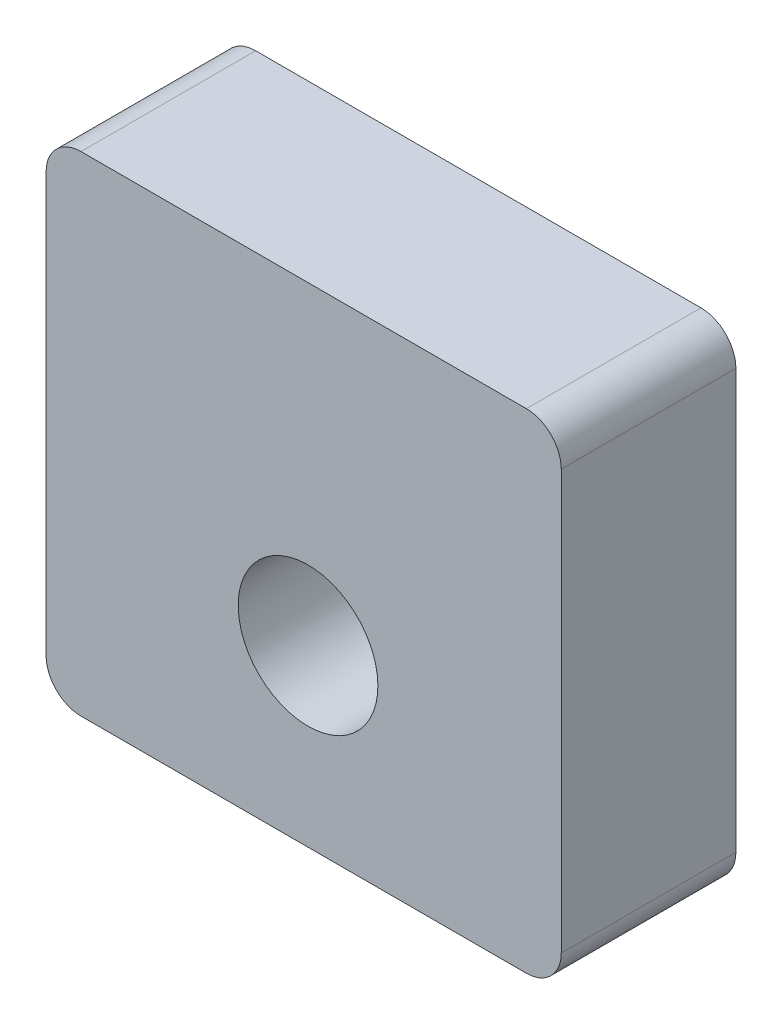
ISO-10303-21;
HEADER;
FILE_DESCRIPTION(('STEP AP214'),'2;1');
FILE_NAME('part.step','',(''),(''),'','','');
FILE_SCHEMA(('AUTOMOTIVE_DESIGN { 1 0 10303 214 1 1 1 1 }'));
ENDSEC;
DATA;
#1=APPLICATION_CONTEXT('core data for automotive mechanical design processes');
#2=APPLICATION_PROTOCOL_DEFINITION('international standard','automotive_design',2000,#1);
#3=PRODUCT_CONTEXT('',#1,'mechanical');
#4=PRODUCT('Part','Part','',(#3));
#5=PRODUCT_RELATED_PRODUCT_CATEGORY('part','',(#4));
#6=PRODUCT_DEFINITION_FORMATION('','',#4);
#7=PRODUCT_DEFINITION_CONTEXT('part definition',#1,'design');
#8=PRODUCT_DEFINITION('design','',#6,#7);
#9=PRODUCT_DEFINITION_SHAPE('','',#8);
#10=(LENGTH_UNIT() NAMED_UNIT(*) SI_UNIT(.MILLI.,.METRE.));
#11=(NAMED_UNIT(*) PLANE_ANGLE_UNIT() SI_UNIT($,.RADIAN.));
#12=(NAMED_UNIT(*) SI_UNIT($,.STERADIAN.) SOLID_ANGLE_UNIT());
#13=UNCERTAINTY_MEASURE_WITH_UNIT(LENGTH_MEASURE(1.E-05),#10,'distance_accuracy_value','');
#14=(GEOMETRIC_REPRESENTATION_CONTEXT(3) GLOBAL_UNCERTAINTY_ASSIGNED_CONTEXT((#13)) GLOBAL_UNIT_ASSIGNED_CONTEXT((#10,
#11,#12)) REPRESENTATION_CONTEXT('',''));
#15=CARTESIAN_POINT('',(0.,0.,0.));
#16=DIRECTION('',(0.,0.,1.));
#17=DIRECTION('',(1.,0.,0.));
#18=AXIS2_PLACEMENT_3D('',#15,#16,#17);
#19=CARTESIAN_POINT('',(-0.25,4.,10.));
#20=DIRECTION('',(0.,0.,1.));
#21=DIRECTION('',(1.,0.,0.));
#22=AXIS2_PLACEMENT_3D('',#19,#20,#21);
#23=PLANE('',#22);
#24=CARTESIAN_POINT('',(0.,0.,10.));
#25=DIRECTION('',(0.,0.,1.));
#26=DIRECTION('',(1.,0.,0.));
#27=AXIS2_PLACEMENT_3D('',#24,#25,#26);
#28=CIRCLE('',#27,4.);
#29=CARTESIAN_POINT('',(4.,0.,10.));
#30=VERTEX_POINT('',#29);
#31=EDGE_CURVE('E129',#30,#30,#28,.F.);
#32=ORIENTED_EDGE('',*,*,#31,.T.);
#33=EDGE_LOOP('',(#32));
#34=FACE_BOUND('',#33,.T.);
#35=DIRECTION('',(1.,0.,0.));
#36=VECTOR('',#35,1.);
#37=CARTESIAN_POINT('',(12.5,-10.,10.));
#38=LINE('',#37,#36);
#39=CARTESIAN_POINT('',(12.5,-10.,10.));
#40=VERTEX_POINT('',#39);
#41=CARTESIAN_POINT('',(-13.,-10.,10.));
#42=VERTEX_POINT('',#41);
#43=EDGE_CURVE('E113',#40,#42,#38,.F.);
#44=ORIENTED_EDGE('',*,*,#43,.F.);
#45=CARTESIAN_POINT('',(12.5,-8.,10.));
#46=DIRECTION('',(0.,0.,1.));
#47=DIRECTION('',(1.,0.,0.));
#48=AXIS2_PLACEMENT_3D('',#45,#46,#47);
#49=CIRCLE('',#48,2.);
#50=CARTESIAN_POINT('',(14.5,-8.,10.));
#51=VERTEX_POINT('',#50);
#52=EDGE_CURVE('E134',#51,#40,#49,.F.);
#53=ORIENTED_EDGE('',*,*,#52,.F.);
#54=DIRECTION('',(0.,1.,0.));
#55=VECTOR('',#54,1.);
#56=CARTESIAN_POINT('',(14.5,16.,10.));
#57=LINE('',#56,#55);
#58=CARTESIAN_POINT('',(14.5,16.,10.));
#59=VERTEX_POINT('',#58);
#60=EDGE_CURVE('E109',#59,#51,#57,.F.);
#61=ORIENTED_EDGE('',*,*,#60,.F.);
#62=CARTESIAN_POINT('',(12.5,16.,10.));
#63=DIRECTION('',(0.,0.,1.));
#64=DIRECTION('',(1.,0.,0.));
#65=AXIS2_PLACEMENT_3D('',#62,#63,#64);
#66=CIRCLE('',#65,2.);
#67=CARTESIAN_POINT('',(12.5,18.,10.));
#68=VERTEX_POINT('',#67);
#69=EDGE_CURVE('E96',#68,#59,#66,.F.);
#70=ORIENTED_EDGE('',*,*,#69,.F.);
#71=DIRECTION('',(1.,0.,0.));
#72=VECTOR('',#71,1.);
#73=CARTESIAN_POINT('',(-13.,18.,10.));
#74=LINE('',#73,#72);
#75=CARTESIAN_POINT('',(-13.,18.,10.));
#76=VERTEX_POINT('',#75);
#77=EDGE_CURVE('E92',#76,#68,#74,.T.);
#78=ORIENTED_EDGE('',*,*,#77,.F.);
#79=CARTESIAN_POINT('',(-13.,16.,10.));
#80=DIRECTION('',(0.,0.,1.));
#81=DIRECTION('',(1.,0.,0.));
#82=AXIS2_PLACEMENT_3D('',#79,#80,#81);
#83=CIRCLE('',#82,2.);
#84=CARTESIAN_POINT('',(-15.,16.,10.));
#85=VERTEX_POINT('',#84);
#86=EDGE_CURVE('E20',#85,#76,#83,.F.);
#87=ORIENTED_EDGE('',*,*,#86,.F.);
#88=DIRECTION('',(0.,1.,0.));
#89=VECTOR('',#88,1.);
#90=CARTESIAN_POINT('',(-15.,-8.,10.));
#91=LINE('',#90,#89);
#92=CARTESIAN_POINT('',(-15.,-8.,10.));
#93=VERTEX_POINT('',#92);
#94=EDGE_CURVE('E79',#93,#85,#91,.T.);
#95=ORIENTED_EDGE('',*,*,#94,.F.);
#96=CARTESIAN_POINT('',(-13.,-8.,10.));
#97=DIRECTION('',(0.,0.,1.));
#98=DIRECTION('',(1.,0.,0.));
#99=AXIS2_PLACEMENT_3D('',#96,#97,#98);
#100=CIRCLE('',#99,2.);
#101=EDGE_CURVE('E135',#42,#93,#100,.F.);
#102=ORIENTED_EDGE('',*,*,#101,.F.);
#103=EDGE_LOOP('',(#44,#53,#61,#70,#78,#87,#95,#102));
#104=FACE_BOUND('',#103,.T.);
#105=ADVANCED_FACE('F17',(#34,#104),#23,.T.);
#106=CARTESIAN_POINT('',(-13.,18.,0.));
#107=DIRECTION('',(0.,1.,0.));
#108=DIRECTION('',(0.,0.,1.));
#109=AXIS2_PLACEMENT_3D('',#106,#107,#108);
#110=PLANE('',#109);
#111=DIRECTION('',(1.,0.,0.));
#112=VECTOR('',#111,1.);
#113=CARTESIAN_POINT('',(-0.25,18.,0.));
#114=LINE('',#113,#112);
#115=CARTESIAN_POINT('',(12.5,18.,0.));
#116=VERTEX_POINT('',#115);
#117=CARTESIAN_POINT('',(-13.,18.,0.));
#118=VERTEX_POINT('',#117);
#119=EDGE_CURVE('E103',#116,#118,#114,.F.);
#120=ORIENTED_EDGE('',*,*,#119,.T.);
#121=DIRECTION('',(0.,0.,1.));
#122=VECTOR('',#121,1.);
#123=CARTESIAN_POINT('',(-13.,18.,0.));
#124=LINE('',#123,#122);
#125=EDGE_CURVE('E88',#76,#118,#124,.F.);
#126=ORIENTED_EDGE('',*,*,#125,.F.);
#127=ORIENTED_EDGE('',*,*,#77,.T.);
#128=DIRECTION('',(0.,0.,1.));
#129=VECTOR('',#128,1.);
#130=CARTESIAN_POINT('',(12.5,18.,0.));
#131=LINE('',#130,#129);
#132=EDGE_CURVE('E132',#116,#68,#131,.T.);
#133=ORIENTED_EDGE('',*,*,#132,.F.);
#134=EDGE_LOOP('',(#120,#126,#127,#133));
#135=FACE_BOUND('',#134,.T.);
#136=ADVANCED_FACE('F102',(#135),#110,.T.);
#137=CARTESIAN_POINT('',(-13.,16.,0.));
#138=DIRECTION('',(0.,0.,1.));
#139=DIRECTION('',(1.,0.,0.));
#140=AXIS2_PLACEMENT_3D('',#137,#138,#139);
#141=CYLINDRICAL_SURFACE('',#140,2.);
#142=CARTESIAN_POINT('',(-13.,16.,0.));
#143=DIRECTION('',(0.,0.,1.));
#144=DIRECTION('',(1.,0.,0.));
#145=AXIS2_PLACEMENT_3D('',#142,#143,#144);
#146=CIRCLE('',#145,2.);
#147=CARTESIAN_POINT('',(-15.,16.,0.));
#148=VERTEX_POINT('',#147);
#149=EDGE_CURVE('E127',#118,#148,#146,.T.);
#150=ORIENTED_EDGE('',*,*,#149,.T.);
#151=DIRECTION('',(0.,0.,1.));
#152=VECTOR('',#151,1.);
#153=CARTESIAN_POINT('',(-15.,16.,0.));
#154=LINE('',#153,#152);
#155=EDGE_CURVE('E90',#85,#148,#154,.F.);
#156=ORIENTED_EDGE('',*,*,#155,.F.);
#157=ORIENTED_EDGE('',*,*,#86,.T.);
#158=ORIENTED_EDGE('',*,*,#125,.T.);
#159=EDGE_LOOP('',(#150,#156,#157,#158));
#160=FACE_BOUND('',#159,.T.);
#161=ADVANCED_FACE('F86',(#160),#141,.T.);
#162=CARTESIAN_POINT('',(-15.,-8.,0.));
#163=DIRECTION('',(-1.,0.,0.));
#164=DIRECTION('',(0.,0.,1.));
#165=AXIS2_PLACEMENT_3D('',#162,#163,#164);
#166=PLANE('',#165);
#167=DIRECTION('',(0.,1.,0.));
#168=VECTOR('',#167,1.);
#169=CARTESIAN_POINT('',(-15.,4.,0.));
#170=LINE('',#169,#168);
#171=CARTESIAN_POINT('',(-15.,-8.,0.));
#172=VERTEX_POINT('',#171);
#173=EDGE_CURVE('E126',#148,#172,#170,.F.);
#174=ORIENTED_EDGE('',*,*,#173,.T.);
#175=DIRECTION('',(0.,0.,1.));
#176=VECTOR('',#175,1.);
#177=CARTESIAN_POINT('',(-15.,-8.,0.));
#178=LINE('',#177,#176);
#179=EDGE_CURVE('E115',#93,#172,#178,.F.);
#180=ORIENTED_EDGE('',*,*,#179,.F.);
#181=ORIENTED_EDGE('',*,*,#94,.T.);
#182=ORIENTED_EDGE('',*,*,#155,.T.);
#183=EDGE_LOOP('',(#174,#180,#181,#182));
#184=FACE_BOUND('',#183,.T.);
#185=ADVANCED_FACE('F141',(#184),#166,.T.);
#186=CARTESIAN_POINT('',(-13.,-8.,0.));
#187=DIRECTION('',(0.,0.,1.));
#188=DIRECTION('',(1.,0.,0.));
#189=AXIS2_PLACEMENT_3D('',#186,#187,#188);
#190=CYLINDRICAL_SURFACE('',#189,2.);
#191=CARTESIAN_POINT('',(-13.,-8.,0.));
#192=DIRECTION('',(0.,0.,1.));
#193=DIRECTION('',(1.,0.,0.));
#194=AXIS2_PLACEMENT_3D('',#191,#192,#193);
#195=CIRCLE('',#194,2.);
#196=CARTESIAN_POINT('',(-13.,-10.,0.));
#197=VERTEX_POINT('',#196);
#198=EDGE_CURVE('E123',#172,#197,#195,.T.);
#199=ORIENTED_EDGE('',*,*,#198,.T.);
#200=DIRECTION('',(0.,0.,-1.));
#201=VECTOR('',#200,1.);
#202=CARTESIAN_POINT('',(-13.,-10.,0.));
#203=LINE('',#202,#201);
#204=EDGE_CURVE('E114',#42,#197,#203,.T.);
#205=ORIENTED_EDGE('',*,*,#204,.F.);
#206=ORIENTED_EDGE('',*,*,#101,.T.);
#207=ORIENTED_EDGE('',*,*,#179,.T.);
#208=EDGE_LOOP('',(#199,#205,#206,#207));
#209=FACE_BOUND('',#208,.T.);
#210=ADVANCED_FACE('F161',(#209),#190,.T.);
#211=CARTESIAN_POINT('',(12.5,-10.,0.));
#212=DIRECTION('',(0.,-1.,0.));
#213=DIRECTION('',(0.,0.,-1.));
#214=AXIS2_PLACEMENT_3D('',#211,#212,#213);
#215=PLANE('',#214);
#216=DIRECTION('',(1.,0.,0.));
#217=VECTOR('',#216,1.);
#218=CARTESIAN_POINT('',(-0.25,-10.,0.));
#219=LINE('',#218,#217);
#220=CARTESIAN_POINT('',(12.5,-10.,0.));
#221=VERTEX_POINT('',#220);
#222=EDGE_CURVE('E122',#197,#221,#219,.T.);
#223=ORIENTED_EDGE('',*,*,#222,.T.);
#224=DIRECTION('',(0.,0.,1.));
#225=VECTOR('',#224,1.);
#226=CARTESIAN_POINT('',(12.5,-10.,0.));
#227=LINE('',#226,#225);
#228=EDGE_CURVE('E112',#40,#221,#227,.F.);
#229=ORIENTED_EDGE('',*,*,#228,.F.);
#230=ORIENTED_EDGE('',*,*,#43,.T.);
#231=ORIENTED_EDGE('',*,*,#204,.T.);
#232=EDGE_LOOP('',(#223,#229,#230,#231));
#233=FACE_BOUND('',#232,.T.);
#234=ADVANCED_FACE('F158',(#233),#215,.T.);
#235=CARTESIAN_POINT('',(12.5,-8.,0.));
#236=DIRECTION('',(0.,0.,1.));
#237=DIRECTION('',(1.,0.,0.));
#238=AXIS2_PLACEMENT_3D('',#235,#236,#237);
#239=CYLINDRICAL_SURFACE('',#238,2.);
#240=CARTESIAN_POINT('',(12.5,-8.,0.));
#241=DIRECTION('',(0.,0.,1.));
#242=DIRECTION('',(1.,0.,0.));
#243=AXIS2_PLACEMENT_3D('',#240,#241,#242);
#244=CIRCLE('',#243,2.);
#245=CARTESIAN_POINT('',(14.5,-8.,0.));
#246=VERTEX_POINT('',#245);
#247=EDGE_CURVE('E119',#221,#246,#244,.T.);
#248=ORIENTED_EDGE('',*,*,#247,.T.);
#249=DIRECTION('',(0.,0.,-1.));
#250=VECTOR('',#249,1.);
#251=CARTESIAN_POINT('',(14.5,-8.,0.));
#252=LINE('',#251,#250);
#253=EDGE_CURVE('E111',#51,#246,#252,.T.);
#254=ORIENTED_EDGE('',*,*,#253,.F.);
#255=ORIENTED_EDGE('',*,*,#52,.T.);
#256=ORIENTED_EDGE('',*,*,#228,.T.);
#257=EDGE_LOOP('',(#248,#254,#255,#256));
#258=FACE_BOUND('',#257,.T.);
#259=ADVANCED_FACE('F169',(#258),#239,.T.);
#260=CARTESIAN_POINT('',(14.5,16.,0.));
#261=DIRECTION('',(1.,0.,0.));
#262=DIRECTION('',(0.,0.,-1.));
#263=AXIS2_PLACEMENT_3D('',#260,#261,#262);
#264=PLANE('',#263);
#265=DIRECTION('',(0.,1.,0.));
#266=VECTOR('',#265,1.);
#267=CARTESIAN_POINT('',(14.5,4.,0.));
#268=LINE('',#267,#266);
#269=CARTESIAN_POINT('',(14.5,16.,0.));
#270=VERTEX_POINT('',#269);
#271=EDGE_CURVE('E118',#246,#270,#268,.T.);
#272=ORIENTED_EDGE('',*,*,#271,.T.);
#273=DIRECTION('',(0.,0.,1.));
#274=VECTOR('',#273,1.);
#275=CARTESIAN_POINT('',(14.5,16.,0.));
#276=LINE('',#275,#274);
#277=EDGE_CURVE('E35',#59,#270,#276,.F.);
#278=ORIENTED_EDGE('',*,*,#277,.F.);
#279=ORIENTED_EDGE('',*,*,#60,.T.);
#280=ORIENTED_EDGE('',*,*,#253,.T.);
#281=EDGE_LOOP('',(#272,#278,#279,#280));
#282=FACE_BOUND('',#281,.T.);
#283=ADVANCED_FACE('F186',(#282),#264,.T.);
#284=CARTESIAN_POINT('',(12.5,16.,0.));
#285=DIRECTION('',(0.,0.,1.));
#286=DIRECTION('',(1.,0.,0.));
#287=AXIS2_PLACEMENT_3D('',#284,#285,#286);
#288=CYLINDRICAL_SURFACE('',#287,2.);
#289=CARTESIAN_POINT('',(12.5,16.,0.));
#290=DIRECTION('',(0.,0.,1.));
#291=DIRECTION('',(1.,0.,0.));
#292=AXIS2_PLACEMENT_3D('',#289,#290,#291);
#293=CIRCLE('',#292,2.);
#294=EDGE_CURVE('E26',#270,#116,#293,.T.);
#295=ORIENTED_EDGE('',*,*,#294,.T.);
#296=ORIENTED_EDGE('',*,*,#132,.T.);
#297=ORIENTED_EDGE('',*,*,#69,.T.);
#298=ORIENTED_EDGE('',*,*,#277,.T.);
#299=EDGE_LOOP('',(#295,#296,#297,#298));
#300=FACE_BOUND('',#299,.T.);
#301=ADVANCED_FACE('F179',(#300),#288,.T.);
#302=CARTESIAN_POINT('',(0.,0.,0.));
#303=DIRECTION('',(0.,0.,1.));
#304=DIRECTION('',(1.,0.,0.));
#305=AXIS2_PLACEMENT_3D('',#302,#303,#304);
#306=CYLINDRICAL_SURFACE('',#305,4.);
#307=CARTESIAN_POINT('',(0.,0.,0.));
#308=DIRECTION('',(0.,0.,1.));
#309=DIRECTION('',(1.,0.,0.));
#310=AXIS2_PLACEMENT_3D('',#307,#308,#309);
#311=CIRCLE('',#310,4.);
#312=CARTESIAN_POINT('',(4.,0.,0.));
#313=VERTEX_POINT('',#312);
#314=EDGE_CURVE('E11',#313,#313,#311,.F.);
#315=ORIENTED_EDGE('',*,*,#314,.T.);
#316=EDGE_LOOP('',(#315));
#317=FACE_BOUND('',#316,.T.);
#318=ORIENTED_EDGE('',*,*,#31,.F.);
#319=EDGE_LOOP('',(#318));
#320=FACE_BOUND('',#319,.T.);
#321=ADVANCED_FACE('F173',(#317,#320),#306,.F.);
#322=CARTESIAN_POINT('',(-0.25,4.,0.));
#323=DIRECTION('',(0.,0.,1.));
#324=DIRECTION('',(1.,0.,0.));
#325=AXIS2_PLACEMENT_3D('',#322,#323,#324);
#326=PLANE('',#325);
#327=ORIENTED_EDGE('',*,*,#314,.F.);
#328=EDGE_LOOP('',(#327));
#329=FACE_BOUND('',#328,.T.);
#330=ORIENTED_EDGE('',*,*,#271,.F.);
#331=ORIENTED_EDGE('',*,*,#247,.F.);
#332=ORIENTED_EDGE('',*,*,#222,.F.);
#333=ORIENTED_EDGE('',*,*,#198,.F.);
#334=ORIENTED_EDGE('',*,*,#173,.F.);
#335=ORIENTED_EDGE('',*,*,#149,.F.);
#336=ORIENTED_EDGE('',*,*,#119,.F.);
#337=ORIENTED_EDGE('',*,*,#294,.F.);
#338=EDGE_LOOP('',(#330,#331,#332,#333,#334,#335,#336,#337));
#339=FACE_BOUND('',#338,.T.);
#340=ADVANCED_FACE('F145',(#329,#339),#326,.F.);
#341=CLOSED_SHELL('',(#105,#136,#161,#185,#210,#234,#259,#283,#301,#321,#340));
#342=MANIFOLD_SOLID_BREP('B1',#341);
#343=ADVANCED_BREP_SHAPE_REPRESENTATION('',(#18,#342),#14);
#344=SHAPE_DEFINITION_REPRESENTATION(#9,#343);
ENDSEC;
END-ISO-10303-21;
